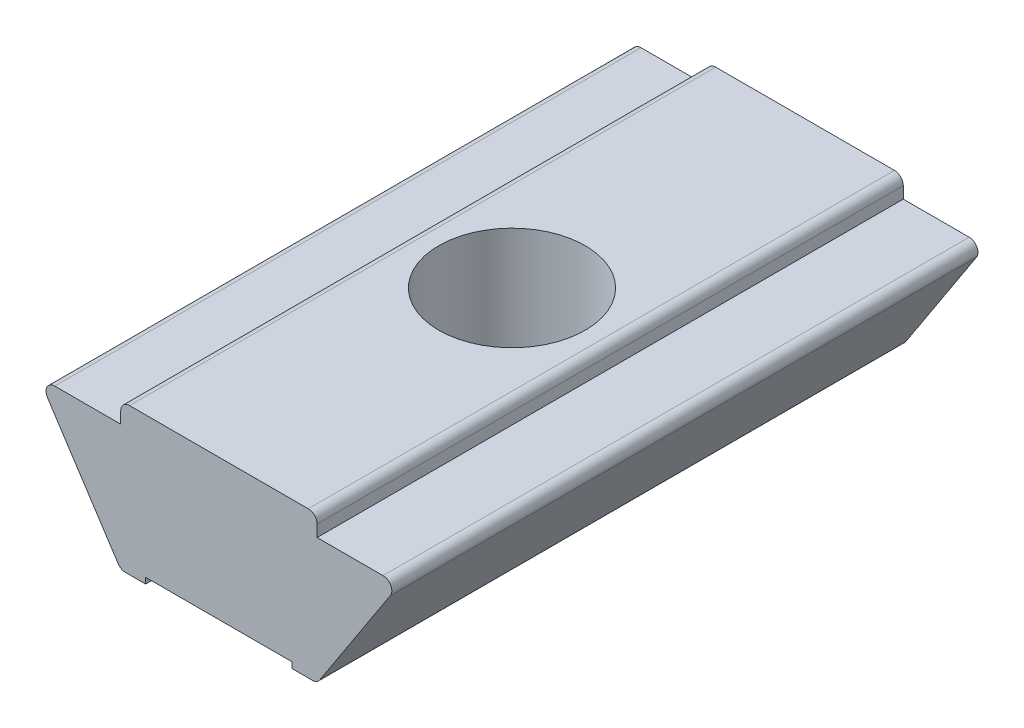
ISO-10303-21;
HEADER;
FILE_DESCRIPTION(('STEP AP214'),'2;1');
FILE_NAME('part.step','',(''),(''),'','','');
FILE_SCHEMA(('AUTOMOTIVE_DESIGN { 1 0 10303 214 1 1 1 1 }'));
ENDSEC;
DATA;
#1=APPLICATION_CONTEXT('core data for automotive mechanical design processes');
#2=APPLICATION_PROTOCOL_DEFINITION('international standard','automotive_design',2000,#1);
#3=PRODUCT_CONTEXT('',#1,'mechanical');
#4=PRODUCT('Part','Part','',(#3));
#5=PRODUCT_RELATED_PRODUCT_CATEGORY('part','',(#4));
#6=PRODUCT_DEFINITION_FORMATION('','',#4);
#7=PRODUCT_DEFINITION_CONTEXT('part definition',#1,'design');
#8=PRODUCT_DEFINITION('design','',#6,#7);
#9=PRODUCT_DEFINITION_SHAPE('','',#8);
#10=(LENGTH_UNIT() NAMED_UNIT(*) SI_UNIT(.MILLI.,.METRE.));
#11=(NAMED_UNIT(*) PLANE_ANGLE_UNIT() SI_UNIT($,.RADIAN.));
#12=(NAMED_UNIT(*) SI_UNIT($,.STERADIAN.) SOLID_ANGLE_UNIT());
#13=UNCERTAINTY_MEASURE_WITH_UNIT(LENGTH_MEASURE(1.E-05),#10,'distance_accuracy_value','');
#14=(GEOMETRIC_REPRESENTATION_CONTEXT(3) GLOBAL_UNCERTAINTY_ASSIGNED_CONTEXT((#13)) GLOBAL_UNIT_ASSIGNED_CONTEXT((#10,
#11,#12)) REPRESENTATION_CONTEXT('',''));
#15=CARTESIAN_POINT('',(0.,0.,0.));
#16=DIRECTION('',(0.,0.,1.));
#17=DIRECTION('',(1.,0.,0.));
#18=AXIS2_PLACEMENT_3D('',#15,#16,#17);
#19=CARTESIAN_POINT('',(0.687460104318916,0.199999999999977,0.));
#20=DIRECTION('',(0.,1.,0.));
#21=DIRECTION('',(-1.,0.,0.));
#22=AXIS2_PLACEMENT_3D('',#19,#20,#21);
#23=PLANE('',#22);
#24=DIRECTION('',(1.,0.,2.52850277105468E-12));
#25=VECTOR('',#24,1.);
#26=CARTESIAN_POINT('',(0.687460104311939,0.199999999999977,2.75940576108429));
#27=LINE('',#26,#25);
#28=CARTESIAN_POINT('',(0.687460104318916,0.199999999999977,2.75940576108429));
#29=VERTEX_POINT('',#28);
#30=CARTESIAN_POINT('',(5.68746010431892,0.199999999999977,2.75940576109693));
#31=VERTEX_POINT('',#30);
#32=EDGE_CURVE('E255',#29,#31,#27,.T.);
#33=ORIENTED_EDGE('',*,*,#32,.F.);
#34=DIRECTION('',(0.,0.,1.));
#35=VECTOR('',#34,1.);
#36=CARTESIAN_POINT('',(0.687460104318916,0.199999999999977,0.));
#37=LINE('',#36,#35);
#38=CARTESIAN_POINT('',(0.687460104318916,0.199999999999977,0.));
#39=VERTEX_POINT('',#38);
#40=EDGE_CURVE('E274',#39,#29,#37,.T.);
#41=ORIENTED_EDGE('',*,*,#40,.F.);
#42=CARTESIAN_POINT('',(3.18746010431892,0.199999999999977,0.));
#43=DIRECTION('',(0.,1.,0.));
#44=DIRECTION('',(-1.,0.,0.));
#45=AXIS2_PLACEMENT_3D('',#42,#43,#44);
#46=CIRCLE('',#45,2.49999999999999);
#47=CARTESIAN_POINT('',(5.68746010431891,0.199999999999978,0.));
#48=VERTEX_POINT('',#47);
#49=EDGE_CURVE('E399',#48,#39,#46,.F.);
#50=ORIENTED_EDGE('',*,*,#49,.F.);
#51=DIRECTION('',(0.,0.,1.));
#52=VECTOR('',#51,1.);
#53=CARTESIAN_POINT('',(5.68746010431892,0.199999999999978,0.));
#54=LINE('',#53,#52);
#55=EDGE_CURVE('E279',#48,#31,#54,.T.);
#56=ORIENTED_EDGE('',*,*,#55,.T.);
#57=EDGE_LOOP('',(#33,#41,#50,#56));
#58=FACE_BOUND('',#57,.T.);
#59=ADVANCED_FACE('F37',(#58),#23,.F.);
#60=DIRECTION('',(1.,-1.13732807893703E-12,0.));
#61=VECTOR('',#60,1.);
#62=CARTESIAN_POINT('',(0.687460104313889,0.199999999999977,3.0031589604741));
#63=LINE('',#62,#61);
#64=CARTESIAN_POINT('',(0.687460104318916,0.199999999999977,3.0031589604741));
#65=VERTEX_POINT('',#64);
#66=CARTESIAN_POINT('',(5.68746010431389,0.19999999999429,3.0031589604741));
#67=VERTEX_POINT('',#66);
#68=EDGE_CURVE('E249',#65,#67,#63,.T.);
#69=ORIENTED_EDGE('',*,*,#68,.T.);
#70=CARTESIAN_POINT('',(5.68746010431892,0.199999999999978,10.));
#71=VERTEX_POINT('',#70);
#72=EDGE_CURVE('E282',#67,#71,#54,.T.);
#73=ORIENTED_EDGE('',*,*,#72,.T.);
#74=DIRECTION('',(-1.,0.,0.));
#75=VECTOR('',#74,1.);
#76=CARTESIAN_POINT('',(0.687460104318916,0.199999999999977,10.));
#77=LINE('',#76,#75);
#78=CARTESIAN_POINT('',(0.687460104318916,0.199999999999977,10.));
#79=VERTEX_POINT('',#78);
#80=EDGE_CURVE('E263',#71,#79,#77,.T.);
#81=ORIENTED_EDGE('',*,*,#80,.T.);
#82=EDGE_CURVE('E278',#65,#79,#37,.T.);
#83=ORIENTED_EDGE('',*,*,#82,.F.);
#84=EDGE_LOOP('',(#69,#73,#81,#83));
#85=FACE_BOUND('',#84,.T.);
#86=ADVANCED_FACE('F503',(#85),#23,.F.);
#87=CARTESIAN_POINT('',(0.687460104318917,0.,0.));
#88=DIRECTION('',(-1.,0.,0.));
#89=DIRECTION('',(0.,-1.,0.));
#90=AXIS2_PLACEMENT_3D('',#87,#88,#89);
#91=PLANE('',#90);
#92=DIRECTION('',(-4.66580283281373E-13,-0.410251025423788,-0.911972640016536));
#93=VECTOR('',#92,1.);
#94=CARTESIAN_POINT('',(0.687460104314014,0.309652412377378,3.0031589604741));
#95=LINE('',#94,#93);
#96=CARTESIAN_POINT('',(0.687460104318917,0.,2.31481326356428));
#97=VERTEX_POINT('',#96);
#98=EDGE_CURVE('E245',#29,#97,#95,.T.);
#99=ORIENTED_EDGE('',*,*,#98,.T.);
#100=DIRECTION('',(0.,0.,1.));
#101=VECTOR('',#100,1.);
#102=CARTESIAN_POINT('',(0.687460104318917,0.,0.));
#103=LINE('',#102,#101);
#104=CARTESIAN_POINT('',(0.687460104318917,0.,0.));
#105=VERTEX_POINT('',#104);
#106=EDGE_CURVE('E288',#105,#97,#103,.T.);
#107=ORIENTED_EDGE('',*,*,#106,.F.);
#108=DIRECTION('',(0.,-1.,0.));
#109=VECTOR('',#108,1.);
#110=CARTESIAN_POINT('',(0.687460104318917,0.,0.));
#111=LINE('',#110,#109);
#112=EDGE_CURVE('E259',#39,#105,#111,.T.);
#113=ORIENTED_EDGE('',*,*,#112,.F.);
#114=ORIENTED_EDGE('',*,*,#40,.T.);
#115=EDGE_LOOP('',(#99,#107,#113,#114));
#116=FACE_BOUND('',#115,.T.);
#117=ADVANCED_FACE('F522',(#116),#91,.F.);
#118=DIRECTION('',(4.66606484518041E-13,0.410251025423788,0.911972640016536));
#119=VECTOR('',#118,1.);
#120=CARTESIAN_POINT('',(0.687460104313889,0.199999999999977,3.0031589604741));
#121=LINE('',#120,#119);
#122=CARTESIAN_POINT('',(0.687460104318917,0.,2.55856646295409));
#123=VERTEX_POINT('',#122);
#124=EDGE_CURVE('E60',#123,#65,#121,.T.);
#125=ORIENTED_EDGE('',*,*,#124,.T.);
#126=ORIENTED_EDGE('',*,*,#82,.T.);
#127=DIRECTION('',(0.,-1.,0.));
#128=VECTOR('',#127,1.);
#129=CARTESIAN_POINT('',(0.687460104318917,0.,10.));
#130=LINE('',#129,#128);
#131=CARTESIAN_POINT('',(0.687460104318917,0.,10.));
#132=VERTEX_POINT('',#131);
#133=EDGE_CURVE('E258',#79,#132,#130,.T.);
#134=ORIENTED_EDGE('',*,*,#133,.T.);
#135=EDGE_CURVE('E266',#123,#132,#103,.T.);
#136=ORIENTED_EDGE('',*,*,#135,.F.);
#137=EDGE_LOOP('',(#125,#126,#134,#136));
#138=FACE_BOUND('',#137,.T.);
#139=ADVANCED_FACE('F500',(#138),#91,.F.);
#140=CARTESIAN_POINT('',(5.68746010431892,0.,0.));
#141=DIRECTION('',(1.,0.,0.));
#142=DIRECTION('',(0.,1.,0.));
#143=AXIS2_PLACEMENT_3D('',#140,#141,#142);
#144=PLANE('',#143);
#145=DIRECTION('',(0.,-0.410251025423788,-0.911972640016536));
#146=VECTOR('',#145,1.);
#147=CARTESIAN_POINT('',(5.68746010431892,-0.866058935191074,0.389596738596369));
#148=LINE('',#147,#146);
#149=CARTESIAN_POINT('',(5.68746010431892,0.,2.31481326357692));
#150=VERTEX_POINT('',#149);
#151=EDGE_CURVE('E45',#31,#150,#148,.T.);
#152=ORIENTED_EDGE('',*,*,#151,.F.);
#153=ORIENTED_EDGE('',*,*,#55,.F.);
#154=DIRECTION('',(0.,1.,0.));
#155=VECTOR('',#154,1.);
#156=CARTESIAN_POINT('',(5.68746010431892,0.,0.));
#157=LINE('',#156,#155);
#158=CARTESIAN_POINT('',(5.68746010431892,0.,0.));
#159=VERTEX_POINT('',#158);
#160=EDGE_CURVE('E262',#159,#48,#157,.T.);
#161=ORIENTED_EDGE('',*,*,#160,.F.);
#162=DIRECTION('',(0.,0.,1.));
#163=VECTOR('',#162,1.);
#164=CARTESIAN_POINT('',(5.68746010431892,0.,0.));
#165=LINE('',#164,#163);
#166=EDGE_CURVE('E283',#159,#150,#165,.T.);
#167=ORIENTED_EDGE('',*,*,#166,.T.);
#168=EDGE_LOOP('',(#152,#153,#161,#167));
#169=FACE_BOUND('',#168,.T.);
#170=ADVANCED_FACE('F410',(#169),#144,.F.);
#171=DIRECTION('',(0.,0.410251025423788,0.911972640016536));
#172=VECTOR('',#171,1.);
#173=CARTESIAN_POINT('',(5.68746010431892,-0.957256199192727,0.430621841138747));
#174=LINE('',#173,#172);
#175=CARTESIAN_POINT('',(5.68746010431892,0.,2.55856646296673));
#176=VERTEX_POINT('',#175);
#177=EDGE_CURVE('E402',#176,#67,#174,.T.);
#178=ORIENTED_EDGE('',*,*,#177,.F.);
#179=CARTESIAN_POINT('',(5.68746010431892,0.,10.));
#180=VERTEX_POINT('',#179);
#181=EDGE_CURVE('E287',#176,#180,#165,.T.);
#182=ORIENTED_EDGE('',*,*,#181,.T.);
#183=DIRECTION('',(0.,1.,0.));
#184=VECTOR('',#183,1.);
#185=CARTESIAN_POINT('',(5.68746010431892,0.,10.));
#186=LINE('',#185,#184);
#187=EDGE_CURVE('E269',#180,#71,#186,.T.);
#188=ORIENTED_EDGE('',*,*,#187,.T.);
#189=ORIENTED_EDGE('',*,*,#72,.F.);
#190=EDGE_LOOP('',(#178,#182,#188,#189));
#191=FACE_BOUND('',#190,.T.);
#192=ADVANCED_FACE('F428',(#191),#144,.F.);
#193=CARTESIAN_POINT('',(0.137460104318961,4.70000000000005,10.));
#194=DIRECTION('',(0.,0.,-1.));
#195=DIRECTION('',(-1.,0.,0.));
#196=AXIS2_PLACEMENT_3D('',#193,#194,#195);
#197=CYLINDRICAL_SURFACE('',#196,0.299999999999955);
#198=CARTESIAN_POINT('',(0.137460104318961,4.70000000000005,-10.));
#199=DIRECTION('',(0.,0.,1.));
#200=DIRECTION('',(1.,0.,0.));
#201=AXIS2_PLACEMENT_3D('',#198,#199,#200);
#202=CIRCLE('',#201,0.299999999999955);
#203=CARTESIAN_POINT('',(0.137460104318961,5.,-10.));
#204=VERTEX_POINT('',#203);
#205=CARTESIAN_POINT('',(-0.162539895680993,4.70000000000016,-10.));
#206=VERTEX_POINT('',#205);
#207=EDGE_CURVE('E297',#204,#206,#202,.T.);
#208=ORIENTED_EDGE('',*,*,#207,.T.);
#209=DIRECTION('',(0.,0.,-1.));
#210=VECTOR('',#209,1.);
#211=CARTESIAN_POINT('',(-0.162539895680993,4.70000000000016,10.));
#212=LINE('',#211,#210);
#213=CARTESIAN_POINT('',(-0.162539895680993,4.70000000000016,10.));
#214=VERTEX_POINT('',#213);
#215=EDGE_CURVE('E396',#214,#206,#212,.T.);
#216=ORIENTED_EDGE('',*,*,#215,.F.);
#217=CARTESIAN_POINT('',(0.137460104318961,4.70000000000005,10.));
#218=DIRECTION('',(0.,0.,1.));
#219=DIRECTION('',(1.,0.,0.));
#220=AXIS2_PLACEMENT_3D('',#217,#218,#219);
#221=CIRCLE('',#220,0.299999999999955);
#222=CARTESIAN_POINT('',(0.137460104318961,5.,10.));
#223=VERTEX_POINT('',#222);
#224=EDGE_CURVE('E298',#223,#214,#221,.T.);
#225=ORIENTED_EDGE('',*,*,#224,.F.);
#226=DIRECTION('',(0.,0.,-1.));
#227=VECTOR('',#226,1.);
#228=CARTESIAN_POINT('',(0.137460104318961,5.,10.));
#229=LINE('',#228,#227);
#230=EDGE_CURVE('E330',#223,#204,#229,.T.);
#231=ORIENTED_EDGE('',*,*,#230,.T.);
#232=EDGE_LOOP('',(#208,#216,#225,#231));
#233=FACE_BOUND('',#232,.T.);
#234=ADVANCED_FACE('F39',(#233),#197,.T.);
#235=CARTESIAN_POINT('',(-0.162539895680993,4.70000000000016,10.));
#236=DIRECTION('',(1.,-1.13732807893703E-12,0.));
#237=DIRECTION('',(1.13732807893703E-12,1.,0.));
#238=AXIS2_PLACEMENT_3D('',#235,#236,#237);
#239=PLANE('',#238);
#240=DIRECTION('',(-1.13732807893703E-12,-1.,0.));
#241=VECTOR('',#240,1.);
#242=CARTESIAN_POINT('',(-0.162539895680993,4.70000000000016,-10.));
#243=LINE('',#242,#241);
#244=CARTESIAN_POINT('',(-0.162539895681448,4.30000000000007,-10.));
#245=VERTEX_POINT('',#244);
#246=EDGE_CURVE('E333',#206,#245,#243,.T.);
#247=ORIENTED_EDGE('',*,*,#246,.T.);
#248=DIRECTION('',(0.,0.,-1.));
#249=VECTOR('',#248,1.);
#250=CARTESIAN_POINT('',(-0.162539895681448,4.30000000000007,10.));
#251=LINE('',#250,#249);
#252=CARTESIAN_POINT('',(-0.162539895681448,4.30000000000007,10.));
#253=VERTEX_POINT('',#252);
#254=EDGE_CURVE('E393',#253,#245,#251,.T.);
#255=ORIENTED_EDGE('',*,*,#254,.F.);
#256=DIRECTION('',(-1.13732807893703E-12,-1.,0.));
#257=VECTOR('',#256,1.);
#258=CARTESIAN_POINT('',(-0.162539895680993,4.70000000000016,10.));
#259=LINE('',#258,#257);
#260=EDGE_CURVE('E301',#214,#253,#259,.T.);
#261=ORIENTED_EDGE('',*,*,#260,.F.);
#262=ORIENTED_EDGE('',*,*,#215,.T.);
#263=EDGE_LOOP('',(#247,#255,#261,#262));
#264=FACE_BOUND('',#263,.T.);
#265=ADVANCED_FACE('F476',(#264),#239,.F.);
#266=CARTESIAN_POINT('',(-2.41253989568122,4.29999999999995,10.));
#267=DIRECTION('',(0.,-1.,0.));
#268=DIRECTION('',(1.,0.,0.));
#269=AXIS2_PLACEMENT_3D('',#266,#267,#268);
#270=PLANE('',#269);
#271=DIRECTION('',(-1.,0.,0.));
#272=VECTOR('',#271,1.);
#273=CARTESIAN_POINT('',(-2.41253989568122,4.29999999999995,-10.));
#274=LINE('',#273,#272);
#275=CARTESIAN_POINT('',(-2.41253989568122,4.29999999999995,-10.));
#276=VERTEX_POINT('',#275);
#277=EDGE_CURVE('E335',#245,#276,#274,.T.);
#278=ORIENTED_EDGE('',*,*,#277,.T.);
#279=DIRECTION('',(0.,0.,-1.));
#280=VECTOR('',#279,1.);
#281=CARTESIAN_POINT('',(-2.41253989568122,4.29999999999995,10.));
#282=LINE('',#281,#280);
#283=CARTESIAN_POINT('',(-2.41253989568122,4.29999999999995,10.));
#284=VERTEX_POINT('',#283);
#285=EDGE_CURVE('E390',#284,#276,#282,.T.);
#286=ORIENTED_EDGE('',*,*,#285,.F.);
#287=DIRECTION('',(-1.,0.,0.));
#288=VECTOR('',#287,1.);
#289=CARTESIAN_POINT('',(-2.41253989568122,4.29999999999995,10.));
#290=LINE('',#289,#288);
#291=EDGE_CURVE('E304',#253,#284,#290,.T.);
#292=ORIENTED_EDGE('',*,*,#291,.F.);
#293=ORIENTED_EDGE('',*,*,#254,.T.);
#294=EDGE_LOOP('',(#278,#286,#292,#293));
#295=FACE_BOUND('',#294,.T.);
#296=ADVANCED_FACE('F481',(#295),#270,.F.);
#297=CARTESIAN_POINT('',(-2.41253989568122,4.,10.));
#298=DIRECTION('',(0.,0.,-1.));
#299=DIRECTION('',(-1.,0.,0.));
#300=AXIS2_PLACEMENT_3D('',#297,#298,#299);
#301=CYLINDRICAL_SURFACE('',#300,0.299999999999944);
#302=CARTESIAN_POINT('',(-2.41253989568122,4.,-10.));
#303=DIRECTION('',(0.,0.,1.));
#304=DIRECTION('',(1.,0.,0.));
#305=AXIS2_PLACEMENT_3D('',#302,#303,#304);
#306=CIRCLE('',#305,0.299999999999944);
#307=CARTESIAN_POINT('',(-2.67057860439082,3.84697704483494,-10.));
#308=VERTEX_POINT('',#307);
#309=EDGE_CURVE('E337',#276,#308,#306,.T.);
#310=ORIENTED_EDGE('',*,*,#309,.T.);
#311=DIRECTION('',(0.,0.,-1.));
#312=VECTOR('',#311,1.);
#313=CARTESIAN_POINT('',(-2.67057860439082,3.84697704483494,10.));
#314=LINE('',#313,#312);
#315=CARTESIAN_POINT('',(-2.67057860439082,3.84697704483494,10.));
#316=VERTEX_POINT('',#315);
#317=EDGE_CURVE('E387',#316,#308,#314,.T.);
#318=ORIENTED_EDGE('',*,*,#317,.F.);
#319=CARTESIAN_POINT('',(-2.41253989568122,4.,10.));
#320=DIRECTION('',(0.,0.,1.));
#321=DIRECTION('',(1.,0.,0.));
#322=AXIS2_PLACEMENT_3D('',#319,#320,#321);
#323=CIRCLE('',#322,0.299999999999944);
#324=EDGE_CURVE('E306',#284,#316,#323,.T.);
#325=ORIENTED_EDGE('',*,*,#324,.F.);
#326=ORIENTED_EDGE('',*,*,#285,.T.);
#327=EDGE_LOOP('',(#310,#318,#325,#326));
#328=FACE_BOUND('',#327,.T.);
#329=ADVANCED_FACE('F487',(#328),#301,.T.);
#330=CARTESIAN_POINT('',(-0.251308862949119,0.136159054558282,10.));
#331=DIRECTION('',(0.837696209830385,0.546136484805591,0.));
#332=DIRECTION('',(-0.546136484805591,0.837696209830386,0.));
#333=AXIS2_PLACEMENT_3D('',#330,#331,#332);
#334=PLANE('',#333);
#335=DIRECTION('',(0.546136484805591,-0.837696209830385,0.));
#336=VECTOR('',#335,1.);
#337=CARTESIAN_POINT('',(-0.251308862949119,0.136159054558282,-10.));
#338=LINE('',#337,#336);
#339=CARTESIAN_POINT('',(-0.251308862949119,0.136159054558282,-10.));
#340=VERTEX_POINT('',#339);
#341=EDGE_CURVE('E339',#308,#340,#338,.T.);
#342=ORIENTED_EDGE('',*,*,#341,.T.);
#343=DIRECTION('',(0.,0.,-1.));
#344=VECTOR('',#343,1.);
#345=CARTESIAN_POINT('',(-0.251308862949119,0.136159054558282,10.));
#346=LINE('',#345,#344);
#347=CARTESIAN_POINT('',(-0.251308862949119,0.136159054558282,10.));
#348=VERTEX_POINT('',#347);
#349=EDGE_CURVE('E384',#348,#340,#346,.T.);
#350=ORIENTED_EDGE('',*,*,#349,.F.);
#351=DIRECTION('',(0.546136484805591,-0.837696209830385,0.));
#352=VECTOR('',#351,1.);
#353=CARTESIAN_POINT('',(-0.251308862949119,0.136159054558282,10.));
#354=LINE('',#353,#352);
#355=EDGE_CURVE('E308',#316,#348,#354,.T.);
#356=ORIENTED_EDGE('',*,*,#355,.F.);
#357=ORIENTED_EDGE('',*,*,#317,.T.);
#358=EDGE_LOOP('',(#342,#350,#356,#357));
#359=FACE_BOUND('',#358,.T.);
#360=ADVANCED_FACE('F491',(#359),#334,.F.);
#361=CARTESIAN_POINT('',(0.,0.299999999999954,10.));
#362=DIRECTION('',(0.,0.,-1.));
#363=DIRECTION('',(-1.,0.,0.));
#364=AXIS2_PLACEMENT_3D('',#361,#362,#363);
#365=CYLINDRICAL_SURFACE('',#364,0.299999999999977);
#366=CARTESIAN_POINT('',(0.,0.299999999999954,-10.));
#367=DIRECTION('',(0.,0.,1.));
#368=DIRECTION('',(1.,0.,0.));
#369=AXIS2_PLACEMENT_3D('',#366,#367,#368);
#370=CIRCLE('',#369,0.299999999999977);
#371=CARTESIAN_POINT('',(0.,0.,-10.));
#372=VERTEX_POINT('',#371);
#373=EDGE_CURVE('E341',#340,#372,#370,.T.);
#374=ORIENTED_EDGE('',*,*,#373,.T.);
#375=DIRECTION('',(0.,0.,-1.));
#376=VECTOR('',#375,1.);
#377=CARTESIAN_POINT('',(0.,0.,10.));
#378=LINE('',#377,#376);
#379=CARTESIAN_POINT('',(0.,0.,10.));
#380=VERTEX_POINT('',#379);
#381=EDGE_CURVE('E381',#380,#372,#378,.T.);
#382=ORIENTED_EDGE('',*,*,#381,.F.);
#383=CARTESIAN_POINT('',(0.,0.299999999999954,10.));
#384=DIRECTION('',(0.,0.,1.));
#385=DIRECTION('',(1.,0.,0.));
#386=AXIS2_PLACEMENT_3D('',#383,#384,#385);
#387=CIRCLE('',#386,0.299999999999977);
#388=EDGE_CURVE('E310',#348,#380,#387,.T.);
#389=ORIENTED_EDGE('',*,*,#388,.F.);
#390=ORIENTED_EDGE('',*,*,#349,.T.);
#391=EDGE_LOOP('',(#374,#382,#389,#390));
#392=FACE_BOUND('',#391,.T.);
#393=ADVANCED_FACE('F496',(#392),#365,.T.);
#394=CARTESIAN_POINT('',(0.,0.,10.));
#395=DIRECTION('',(0.,1.,0.));
#396=DIRECTION('',(-1.,0.,0.));
#397=AXIS2_PLACEMENT_3D('',#394,#395,#396);
#398=PLANE('',#397);
#399=CARTESIAN_POINT('',(3.18746010431892,0.,0.));
#400=DIRECTION('',(0.,1.,0.));
#401=DIRECTION('',(0.,0.,1.));
#402=AXIS2_PLACEMENT_3D('',#399,#400,#401);
#403=CIRCLE('',#402,2.5);
#404=EDGE_CURVE('E294',#159,#105,#403,.T.);
#405=ORIENTED_EDGE('',*,*,#404,.T.);
#406=ORIENTED_EDGE('',*,*,#106,.T.);
#407=EDGE_CURVE('E291',#97,#123,#103,.T.);
#408=ORIENTED_EDGE('',*,*,#407,.T.);
#409=ORIENTED_EDGE('',*,*,#135,.T.);
#410=DIRECTION('',(1.,0.,0.));
#411=VECTOR('',#410,1.);
#412=CARTESIAN_POINT('',(0.,0.,10.));
#413=LINE('',#412,#411);
#414=EDGE_CURVE('E313',#380,#132,#413,.T.);
#415=ORIENTED_EDGE('',*,*,#414,.F.);
#416=ORIENTED_EDGE('',*,*,#381,.T.);
#417=DIRECTION('',(1.,0.,0.));
#418=VECTOR('',#417,1.);
#419=CARTESIAN_POINT('',(0.,0.,-10.));
#420=LINE('',#419,#418);
#421=CARTESIAN_POINT('',(6.3749202086376,1.13624387676481E-13,-10.));
#422=VERTEX_POINT('',#421);
#423=EDGE_CURVE('E343',#372,#422,#420,.T.);
#424=ORIENTED_EDGE('',*,*,#423,.T.);
#425=DIRECTION('',(0.,0.,-1.));
#426=VECTOR('',#425,1.);
#427=CARTESIAN_POINT('',(6.3749202086376,1.13624387676481E-13,10.));
#428=LINE('',#427,#426);
#429=CARTESIAN_POINT('',(6.3749202086376,1.13624387676481E-13,10.));
#430=VERTEX_POINT('',#429);
#431=EDGE_CURVE('E378',#430,#422,#428,.T.);
#432=ORIENTED_EDGE('',*,*,#431,.F.);
#433=EDGE_CURVE('E312',#180,#430,#413,.T.);
#434=ORIENTED_EDGE('',*,*,#433,.F.);
#435=ORIENTED_EDGE('',*,*,#181,.F.);
#436=EDGE_CURVE('E286',#150,#176,#165,.T.);
#437=ORIENTED_EDGE('',*,*,#436,.F.);
#438=ORIENTED_EDGE('',*,*,#166,.F.);
#439=EDGE_LOOP('',(#405,#406,#408,#409,#415,#416,#424,#432,#434,#435,#437,#438));
#440=FACE_BOUND('',#439,.T.);
#441=ADVANCED_FACE('F420',(#440),#398,.F.);
#442=CARTESIAN_POINT('',(6.3749202086376,0.300000000000068,10.));
#443=DIRECTION('',(0.,0.,-1.));
#444=DIRECTION('',(-1.,0.,0.));
#445=AXIS2_PLACEMENT_3D('',#442,#443,#444);
#446=CYLINDRICAL_SURFACE('',#445,0.300000000000005);
#447=CARTESIAN_POINT('',(6.3749202086376,0.300000000000068,-10.));
#448=DIRECTION('',(0.,0.,1.));
#449=DIRECTION('',(1.,0.,0.));
#450=AXIS2_PLACEMENT_3D('',#447,#448,#449);
#451=CIRCLE('',#450,0.300000000000005);
#452=CARTESIAN_POINT('',(6.62622907158671,0.136159054558361,-10.));
#453=VERTEX_POINT('',#452);
#454=EDGE_CURVE('E345',#422,#453,#451,.T.);
#455=ORIENTED_EDGE('',*,*,#454,.T.);
#456=DIRECTION('',(0.,0.,-1.));
#457=VECTOR('',#456,1.);
#458=CARTESIAN_POINT('',(6.62622907158671,0.136159054558361,10.));
#459=LINE('',#458,#457);
#460=CARTESIAN_POINT('',(6.62622907158671,0.136159054558361,10.));
#461=VERTEX_POINT('',#460);
#462=EDGE_CURVE('E375',#461,#453,#459,.T.);
#463=ORIENTED_EDGE('',*,*,#462,.F.);
#464=CARTESIAN_POINT('',(6.3749202086376,0.300000000000068,10.));
#465=DIRECTION('',(0.,0.,1.));
#466=DIRECTION('',(1.,0.,0.));
#467=AXIS2_PLACEMENT_3D('',#464,#465,#466);
#468=CIRCLE('',#467,0.300000000000005);
#469=EDGE_CURVE('E316',#430,#461,#468,.T.);
#470=ORIENTED_EDGE('',*,*,#469,.F.);
#471=ORIENTED_EDGE('',*,*,#431,.T.);
#472=EDGE_LOOP('',(#455,#463,#470,#471));
#473=FACE_BOUND('',#472,.T.);
#474=ADVANCED_FACE('F439',(#473),#446,.T.);
#475=CARTESIAN_POINT('',(6.62622907158675,0.136159054558334,10.));
#476=DIRECTION('',(-0.837696209830361,0.546136484805628,0.));
#477=DIRECTION('',(-0.546136484805628,-0.837696209830361,0.));
#478=AXIS2_PLACEMENT_3D('',#475,#476,#477);
#479=PLANE('',#478);
#480=DIRECTION('',(0.546136484805628,0.837696209830361,0.));
#481=VECTOR('',#480,1.);
#482=CARTESIAN_POINT('',(6.62622907158675,0.136159054558334,-10.));
#483=LINE('',#482,#481);
#484=CARTESIAN_POINT('',(9.04549881302865,3.84697704483494,-10.));
#485=VERTEX_POINT('',#484);
#486=EDGE_CURVE('E347',#453,#485,#483,.T.);
#487=ORIENTED_EDGE('',*,*,#486,.T.);
#488=DIRECTION('',(0.,0.,-1.));
#489=VECTOR('',#488,1.);
#490=CARTESIAN_POINT('',(9.04549881302865,3.84697704483494,10.));
#491=LINE('',#490,#489);
#492=CARTESIAN_POINT('',(9.04549881302865,3.84697704483494,10.));
#493=VERTEX_POINT('',#492);
#494=EDGE_CURVE('E372',#493,#485,#491,.T.);
#495=ORIENTED_EDGE('',*,*,#494,.F.);
#496=DIRECTION('',(0.546136484805628,0.837696209830361,0.));
#497=VECTOR('',#496,1.);
#498=CARTESIAN_POINT('',(6.62622907158675,0.136159054558334,10.));
#499=LINE('',#498,#497);
#500=EDGE_CURVE('E318',#461,#493,#499,.T.);
#501=ORIENTED_EDGE('',*,*,#500,.F.);
#502=ORIENTED_EDGE('',*,*,#462,.T.);
#503=EDGE_LOOP('',(#487,#495,#501,#502));
#504=FACE_BOUND('',#503,.T.);
#505=ADVANCED_FACE('F445',(#504),#479,.F.);
#506=CARTESIAN_POINT('',(8.78746010431905,4.,10.));
#507=DIRECTION('',(0.,0.,-1.));
#508=DIRECTION('',(-1.,0.,0.));
#509=AXIS2_PLACEMENT_3D('',#506,#507,#508);
#510=CYLINDRICAL_SURFACE('',#509,0.299999999999945);
#511=CARTESIAN_POINT('',(8.78746010431905,4.,-10.));
#512=DIRECTION('',(0.,0.,1.));
#513=DIRECTION('',(1.,0.,0.));
#514=AXIS2_PLACEMENT_3D('',#511,#512,#513);
#515=CIRCLE('',#514,0.299999999999945);
#516=CARTESIAN_POINT('',(8.78746010431905,4.29999999999994,-10.));
#517=VERTEX_POINT('',#516);
#518=EDGE_CURVE('E349',#485,#517,#515,.T.);
#519=ORIENTED_EDGE('',*,*,#518,.T.);
#520=DIRECTION('',(0.,0.,-1.));
#521=VECTOR('',#520,1.);
#522=CARTESIAN_POINT('',(8.78746010431905,4.29999999999994,10.));
#523=LINE('',#522,#521);
#524=CARTESIAN_POINT('',(8.78746010431905,4.29999999999994,10.));
#525=VERTEX_POINT('',#524);
#526=EDGE_CURVE('E369',#525,#517,#523,.T.);
#527=ORIENTED_EDGE('',*,*,#526,.F.);
#528=CARTESIAN_POINT('',(8.78746010431905,4.,10.));
#529=DIRECTION('',(0.,0.,1.));
#530=DIRECTION('',(1.,0.,0.));
#531=AXIS2_PLACEMENT_3D('',#528,#529,#530);
#532=CIRCLE('',#531,0.299999999999945);
#533=EDGE_CURVE('E320',#493,#525,#532,.T.);
#534=ORIENTED_EDGE('',*,*,#533,.F.);
#535=ORIENTED_EDGE('',*,*,#494,.T.);
#536=EDGE_LOOP('',(#519,#527,#534,#535));
#537=FACE_BOUND('',#536,.T.);
#538=ADVANCED_FACE('F449',(#537),#510,.T.);
#539=CARTESIAN_POINT('',(6.53746010431883,4.30000000000007,10.));
#540=DIRECTION('',(0.,-1.,0.));
#541=DIRECTION('',(1.,0.,0.));
#542=AXIS2_PLACEMENT_3D('',#539,#540,#541);
#543=PLANE('',#542);
#544=DIRECTION('',(-1.,0.,0.));
#545=VECTOR('',#544,1.);
#546=CARTESIAN_POINT('',(6.53746010431883,4.30000000000007,-10.));
#547=LINE('',#546,#545);
#548=CARTESIAN_POINT('',(6.53746010431883,4.30000000000007,-10.));
#549=VERTEX_POINT('',#548);
#550=EDGE_CURVE('E351',#517,#549,#547,.T.);
#551=ORIENTED_EDGE('',*,*,#550,.T.);
#552=DIRECTION('',(0.,0.,-1.));
#553=VECTOR('',#552,1.);
#554=CARTESIAN_POINT('',(6.53746010431883,4.30000000000007,10.));
#555=LINE('',#554,#553);
#556=CARTESIAN_POINT('',(6.53746010431883,4.30000000000007,10.));
#557=VERTEX_POINT('',#556);
#558=EDGE_CURVE('E366',#557,#549,#555,.T.);
#559=ORIENTED_EDGE('',*,*,#558,.F.);
#560=DIRECTION('',(-1.,0.,0.));
#561=VECTOR('',#560,1.);
#562=CARTESIAN_POINT('',(6.53746010431883,4.30000000000007,10.));
#563=LINE('',#562,#561);
#564=EDGE_CURVE('E322',#525,#557,#563,.T.);
#565=ORIENTED_EDGE('',*,*,#564,.F.);
#566=ORIENTED_EDGE('',*,*,#526,.T.);
#567=EDGE_LOOP('',(#551,#559,#565,#566));
#568=FACE_BOUND('',#567,.T.);
#569=ADVANCED_FACE('F454',(#568),#543,.F.);
#570=CARTESIAN_POINT('',(6.53746010431883,4.70000000000016,10.));
#571=DIRECTION('',(-1.,0.,0.));
#572=DIRECTION('',(0.,0.,1.));
#573=AXIS2_PLACEMENT_3D('',#570,#571,#572);
#574=PLANE('',#573);
#575=DIRECTION('',(0.,1.,0.));
#576=VECTOR('',#575,1.);
#577=CARTESIAN_POINT('',(6.53746010431883,4.70000000000016,-10.));
#578=LINE('',#577,#576);
#579=CARTESIAN_POINT('',(6.53746010431883,4.70000000000016,-10.));
#580=VERTEX_POINT('',#579);
#581=EDGE_CURVE('E353',#549,#580,#578,.T.);
#582=ORIENTED_EDGE('',*,*,#581,.T.);
#583=DIRECTION('',(0.,0.,-1.));
#584=VECTOR('',#583,1.);
#585=CARTESIAN_POINT('',(6.53746010431883,4.70000000000016,10.));
#586=LINE('',#585,#584);
#587=CARTESIAN_POINT('',(6.53746010431883,4.70000000000016,10.));
#588=VERTEX_POINT('',#587);
#589=EDGE_CURVE('E363',#588,#580,#586,.T.);
#590=ORIENTED_EDGE('',*,*,#589,.F.);
#591=DIRECTION('',(0.,1.,0.));
#592=VECTOR('',#591,1.);
#593=CARTESIAN_POINT('',(6.53746010431883,4.70000000000016,10.));
#594=LINE('',#593,#592);
#595=EDGE_CURVE('E324',#557,#588,#594,.T.);
#596=ORIENTED_EDGE('',*,*,#595,.F.);
#597=ORIENTED_EDGE('',*,*,#558,.T.);
#598=EDGE_LOOP('',(#582,#590,#596,#597));
#599=FACE_BOUND('',#598,.T.);
#600=ADVANCED_FACE('F460',(#599),#574,.F.);
#601=CARTESIAN_POINT('',(6.23746010431887,4.70000000000005,10.));
#602=DIRECTION('',(0.,0.,-1.));
#603=DIRECTION('',(-1.,0.,0.));
#604=AXIS2_PLACEMENT_3D('',#601,#602,#603);
#605=CYLINDRICAL_SURFACE('',#604,0.299999999999977);
#606=CARTESIAN_POINT('',(6.23746010431887,4.70000000000005,-10.));
#607=DIRECTION('',(0.,0.,1.));
#608=DIRECTION('',(1.,0.,0.));
#609=AXIS2_PLACEMENT_3D('',#606,#607,#608);
#610=CIRCLE('',#609,0.299999999999977);
#611=CARTESIAN_POINT('',(6.23746010431887,5.00000000000002,-10.));
#612=VERTEX_POINT('',#611);
#613=EDGE_CURVE('E355',#580,#612,#610,.T.);
#614=ORIENTED_EDGE('',*,*,#613,.T.);
#615=DIRECTION('',(0.,0.,-1.));
#616=VECTOR('',#615,1.);
#617=CARTESIAN_POINT('',(6.23746010431887,5.00000000000002,10.));
#618=LINE('',#617,#616);
#619=CARTESIAN_POINT('',(6.23746010431887,5.00000000000002,10.));
#620=VERTEX_POINT('',#619);
#621=EDGE_CURVE('E360',#620,#612,#618,.T.);
#622=ORIENTED_EDGE('',*,*,#621,.F.);
#623=CARTESIAN_POINT('',(6.23746010431887,4.70000000000005,10.));
#624=DIRECTION('',(0.,0.,1.));
#625=DIRECTION('',(1.,0.,0.));
#626=AXIS2_PLACEMENT_3D('',#623,#624,#625);
#627=CIRCLE('',#626,0.299999999999977);
#628=EDGE_CURVE('E326',#588,#620,#627,.T.);
#629=ORIENTED_EDGE('',*,*,#628,.F.);
#630=ORIENTED_EDGE('',*,*,#589,.T.);
#631=EDGE_LOOP('',(#614,#622,#629,#630));
#632=FACE_BOUND('',#631,.T.);
#633=ADVANCED_FACE('F464',(#632),#605,.T.);
#634=CARTESIAN_POINT('',(6.23746010431887,5.00000000000005,10.));
#635=DIRECTION('',(0.,-1.,0.));
#636=DIRECTION('',(1.,0.,0.));
#637=AXIS2_PLACEMENT_3D('',#634,#635,#636);
#638=PLANE('',#637);
#639=CARTESIAN_POINT('',(3.18746010431892,5.00000000000002,0.));
#640=DIRECTION('',(0.,1.,0.));
#641=DIRECTION('',(0.,0.,1.));
#642=AXIS2_PLACEMENT_3D('',#639,#640,#641);
#643=CIRCLE('',#642,2.49999999999999);
#644=CARTESIAN_POINT('',(3.18746010431892,5.00000000000002,2.49999999999999));
#645=VERTEX_POINT('',#644);
#646=EDGE_CURVE('E277',#645,#645,#643,.T.);
#647=ORIENTED_EDGE('',*,*,#646,.F.);
#648=EDGE_LOOP('',(#647));
#649=FACE_BOUND('',#648,.T.);
#650=DIRECTION('',(-1.,0.,0.));
#651=VECTOR('',#650,1.);
#652=CARTESIAN_POINT('',(6.23746010431887,5.00000000000005,-10.));
#653=LINE('',#652,#651);
#654=EDGE_CURVE('E302',#612,#204,#653,.T.);
#655=ORIENTED_EDGE('',*,*,#654,.T.);
#656=ORIENTED_EDGE('',*,*,#230,.F.);
#657=DIRECTION('',(-1.,0.,0.));
#658=VECTOR('',#657,1.);
#659=CARTESIAN_POINT('',(6.23746010431887,5.00000000000005,10.));
#660=LINE('',#659,#658);
#661=EDGE_CURVE('E328',#620,#223,#660,.T.);
#662=ORIENTED_EDGE('',*,*,#661,.F.);
#663=ORIENTED_EDGE('',*,*,#621,.T.);
#664=EDGE_LOOP('',(#655,#656,#662,#663));
#665=FACE_BOUND('',#664,.T.);
#666=ADVANCED_FACE('F469',(#649,#665),#638,.F.);
#667=CARTESIAN_POINT('',(0.137460104318961,4.70000000000005,10.));
#668=DIRECTION('',(0.,0.,1.));
#669=DIRECTION('',(1.,0.,0.));
#670=AXIS2_PLACEMENT_3D('',#667,#668,#669);
#671=PLANE('',#670);
#672=ORIENTED_EDGE('',*,*,#133,.F.);
#673=ORIENTED_EDGE('',*,*,#80,.F.);
#674=ORIENTED_EDGE('',*,*,#187,.F.);
#675=ORIENTED_EDGE('',*,*,#433,.T.);
#676=ORIENTED_EDGE('',*,*,#469,.T.);
#677=ORIENTED_EDGE('',*,*,#500,.T.);
#678=ORIENTED_EDGE('',*,*,#533,.T.);
#679=ORIENTED_EDGE('',*,*,#564,.T.);
#680=ORIENTED_EDGE('',*,*,#595,.T.);
#681=ORIENTED_EDGE('',*,*,#628,.T.);
#682=ORIENTED_EDGE('',*,*,#661,.T.);
#683=ORIENTED_EDGE('',*,*,#224,.T.);
#684=ORIENTED_EDGE('',*,*,#260,.T.);
#685=ORIENTED_EDGE('',*,*,#291,.T.);
#686=ORIENTED_EDGE('',*,*,#324,.T.);
#687=ORIENTED_EDGE('',*,*,#355,.T.);
#688=ORIENTED_EDGE('',*,*,#388,.T.);
#689=ORIENTED_EDGE('',*,*,#414,.T.);
#690=EDGE_LOOP('',(#672,#673,#674,#675,#676,#677,#678,#679,#680,#681,#682,#683,#684,#685,#686,
#687,#688,#689));
#691=FACE_BOUND('',#690,.T.);
#692=ADVANCED_FACE('F432',(#691),#671,.T.);
#693=CARTESIAN_POINT('',(0.137460104318961,4.70000000000005,-10.));
#694=DIRECTION('',(0.,0.,1.));
#695=DIRECTION('',(1.,0.,0.));
#696=AXIS2_PLACEMENT_3D('',#693,#694,#695);
#697=PLANE('',#696);
#698=ORIENTED_EDGE('',*,*,#207,.F.);
#699=ORIENTED_EDGE('',*,*,#654,.F.);
#700=ORIENTED_EDGE('',*,*,#613,.F.);
#701=ORIENTED_EDGE('',*,*,#581,.F.);
#702=ORIENTED_EDGE('',*,*,#550,.F.);
#703=ORIENTED_EDGE('',*,*,#518,.F.);
#704=ORIENTED_EDGE('',*,*,#486,.F.);
#705=ORIENTED_EDGE('',*,*,#454,.F.);
#706=ORIENTED_EDGE('',*,*,#423,.F.);
#707=ORIENTED_EDGE('',*,*,#373,.F.);
#708=ORIENTED_EDGE('',*,*,#341,.F.);
#709=ORIENTED_EDGE('',*,*,#309,.F.);
#710=ORIENTED_EDGE('',*,*,#277,.F.);
#711=ORIENTED_EDGE('',*,*,#246,.F.);
#712=EDGE_LOOP('',(#698,#699,#700,#701,#702,#703,#704,#705,#706,#707,#708,#709,#710,#711));
#713=FACE_BOUND('',#712,.T.);
#714=ADVANCED_FACE('F531',(#713),#697,.F.);
#715=CARTESIAN_POINT('',(3.18746010431892,5.00000000000002,0.));
#716=DIRECTION('',(0.,1.,0.));
#717=DIRECTION('',(0.,0.,1.));
#718=AXIS2_PLACEMENT_3D('',#715,#716,#717);
#719=CYLINDRICAL_SURFACE('',#718,2.49999999999999);
#720=ORIENTED_EDGE('',*,*,#49,.T.);
#721=ORIENTED_EDGE('',*,*,#112,.T.);
#722=ORIENTED_EDGE('',*,*,#404,.F.);
#723=ORIENTED_EDGE('',*,*,#160,.T.);
#724=EDGE_LOOP('',(#720,#721,#722,#723));
#725=FACE_BOUND('',#724,.T.);
#726=ORIENTED_EDGE('',*,*,#646,.T.);
#727=EDGE_LOOP('',(#726));
#728=FACE_BOUND('',#727,.T.);
#729=ADVANCED_FACE('F417',(#725,#728),#719,.F.);
#730=CARTESIAN_POINT('',(0.687460104313659,-7.74764491286619E-13,0.));
#731=DIRECTION('',(-1.,1.13509959975115E-12,0.));
#732=DIRECTION('',(-1.13509959975115E-12,-1.,0.));
#733=AXIS2_PLACEMENT_3D('',#730,#731,#732);
#734=PLANE('',#733);
#735=DIRECTION('',(-1.03721209071314E-12,-0.911972640016536,0.410251025423788));
#736=VECTOR('',#735,1.);
#737=CARTESIAN_POINT('',(0.687460104321195,-0.342835652866826,1.06519606904988));
#738=LINE('',#737,#736);
#739=CARTESIAN_POINT('',(0.687460104320988,-0.525230180870133,1.14724627413463));
#740=VERTEX_POINT('',#739);
#741=CARTESIAN_POINT('',(0.687460104320884,-0.616427444871787,1.18827137667701));
#742=VERTEX_POINT('',#741);
#743=EDGE_CURVE('E230',#740,#742,#738,.T.);
#744=ORIENTED_EDGE('',*,*,#743,.T.);
#745=EDGE_CURVE('E247',#742,#123,#121,.T.);
#746=ORIENTED_EDGE('',*,*,#745,.T.);
#747=ORIENTED_EDGE('',*,*,#407,.F.);
#748=EDGE_CURVE('E242',#97,#740,#95,.T.);
#749=ORIENTED_EDGE('',*,*,#748,.T.);
#750=EDGE_LOOP('',(#744,#746,#747,#749));
#751=FACE_BOUND('',#750,.T.);
#752=ADVANCED_FACE('F506',(#751),#734,.T.);
#753=CARTESIAN_POINT('',(5.68746010431366,-6.46140488597179E-12,0.));
#754=DIRECTION('',(-1.,1.13509959975115E-12,0.));
#755=DIRECTION('',(-1.13509959975115E-12,-1.,0.));
#756=AXIS2_PLACEMENT_3D('',#753,#754,#755);
#757=PLANE('',#756);
#758=DIRECTION('',(4.66606484518041E-13,0.410251025423788,0.911972640016536));
#759=VECTOR('',#758,1.);
#760=CARTESIAN_POINT('',(5.68746010431389,0.19999999999429,3.0031589604741));
#761=LINE('',#760,#759);
#762=CARTESIAN_POINT('',(5.68746010431296,-0.616427444874312,1.18827137668404));
#763=VERTEX_POINT('',#762);
#764=EDGE_CURVE('E246',#763,#176,#761,.T.);
#765=ORIENTED_EDGE('',*,*,#764,.F.);
#766=DIRECTION('',(-1.03721209071314E-12,-0.911972640016536,0.410251025423788));
#767=VECTOR('',#766,1.);
#768=CARTESIAN_POINT('',(5.68746010431113,-0.342835652871555,1.065196069052));
#769=LINE('',#768,#767);
#770=CARTESIAN_POINT('',(5.68746010431092,-0.525230180874862,1.14724627413676));
#771=VERTEX_POINT('',#770);
#772=EDGE_CURVE('E52',#771,#763,#769,.T.);
#773=ORIENTED_EDGE('',*,*,#772,.F.);
#774=DIRECTION('',(-4.66580283281373E-13,-0.410251025423788,-0.911972640016536));
#775=VECTOR('',#774,1.);
#776=CARTESIAN_POINT('',(5.68746010431401,0.309652412371691,3.0031589604741));
#777=LINE('',#776,#775);
#778=EDGE_CURVE('E241',#150,#771,#777,.T.);
#779=ORIENTED_EDGE('',*,*,#778,.F.);
#780=ORIENTED_EDGE('',*,*,#436,.T.);
#781=EDGE_LOOP('',(#765,#773,#779,#780));
#782=FACE_BOUND('',#781,.T.);
#783=ADVANCED_FACE('F504',(#782),#757,.F.);
#784=CARTESIAN_POINT('',(0.687460104314014,0.309652412377378,3.0031589604741));
#785=DIRECTION('',(-1.03721209071314E-12,-0.911972640016536,0.410251025423788));
#786=DIRECTION('',(0.,-0.410251025423788,-0.911972640016536));
#787=AXIS2_PLACEMENT_3D('',#784,#785,#786);
#788=PLANE('',#787);
#789=CARTESIAN_POINT('',(3.18746010431596,-1.99855171057633,-2.12789221856946));
#790=DIRECTION('',(-1.03721209071314E-12,-0.911972640016536,0.410251025423788));
#791=DIRECTION('',(0.,-0.410251025423788,-0.911972640016536));
#792=AXIS2_PLACEMENT_3D('',#789,#790,#791);
#793=CIRCLE('',#792,0.999999999988135);
#794=CARTESIAN_POINT('',(4.15627611335089,-2.10020421647884,-2.35386192595883));
#795=VERTEX_POINT('',#794);
#796=CARTESIAN_POINT('',(2.21864409528102,-2.10020421647701,-2.35386192595966));
#797=VERTEX_POINT('',#796);
#798=EDGE_CURVE('E222',#795,#797,#793,.F.);
#799=ORIENTED_EDGE('',*,*,#798,.T.);
#800=DIRECTION('',(-0.37046528485863,0.381060152268322,0.847082424010708));
#801=VECTOR('',#800,1.);
#802=CARTESIAN_POINT('',(-0.012812458010465,0.195069345529973,2.74844510115638));
#803=LINE('',#802,#801);
#804=EDGE_CURVE('E238',#797,#740,#803,.T.);
#805=ORIENTED_EDGE('',*,*,#804,.T.);
#806=ORIENTED_EDGE('',*,*,#748,.F.);
#807=ORIENTED_EDGE('',*,*,#98,.F.);
#808=ORIENTED_EDGE('',*,*,#32,.T.);
#809=ORIENTED_EDGE('',*,*,#151,.T.);
#810=ORIENTED_EDGE('',*,*,#778,.T.);
#811=DIRECTION('',(-0.37046528485863,-0.381060152267621,-0.847082424011023));
#812=VECTOR('',#811,1.);
#813=CARTESIAN_POINT('',(5.70151003021491,-0.510778443767117,1.17937194360797));
#814=LINE('',#813,#812);
#815=EDGE_CURVE('E233',#771,#795,#814,.T.);
#816=ORIENTED_EDGE('',*,*,#815,.T.);
#817=EDGE_LOOP('',(#799,#805,#806,#807,#808,#809,#810,#816));
#818=FACE_BOUND('',#817,.T.);
#819=ADVANCED_FACE('F406',(#818),#788,.F.);
#820=CARTESIAN_POINT('',(0.687460104313889,0.199999999999977,3.0031589604741));
#821=DIRECTION('',(1.03721209071314E-12,0.911972640016536,-0.410251025423788));
#822=DIRECTION('',(0.,0.410251025423788,0.911972640016536));
#823=AXIS2_PLACEMENT_3D('',#820,#821,#822);
#824=PLANE('',#823);
#825=ORIENTED_EDGE('',*,*,#745,.F.);
#826=DIRECTION('',(-0.37046528485863,0.381060152268322,0.847082424010708));
#827=VECTOR('',#826,1.);
#828=CARTESIAN_POINT('',(0.687460104320884,-0.616427444871787,1.18827137667701));
#829=LINE('',#828,#827);
#830=CARTESIAN_POINT('',(2.21864409528092,-2.19140148047867,-2.31283682341728));
#831=VERTEX_POINT('',#830);
#832=EDGE_CURVE('E216',#831,#742,#829,.T.);
#833=ORIENTED_EDGE('',*,*,#832,.F.);
#834=CARTESIAN_POINT('',(3.18746010431585,-2.08974897457799,-2.08686711602708));
#835=DIRECTION('',(1.03721209071314E-12,0.911972640016536,-0.410251025423788));
#836=DIRECTION('',(0.,0.410251025423788,0.911972640016536));
#837=AXIS2_PLACEMENT_3D('',#834,#835,#836);
#838=CIRCLE('',#837,0.999999999988135);
#839=CARTESIAN_POINT('',(4.15627611335078,-2.1914014804805,-2.31283682341645));
#840=VERTEX_POINT('',#839);
#841=EDGE_CURVE('E11',#831,#840,#838,.F.);
#842=ORIENTED_EDGE('',*,*,#841,.T.);
#843=DIRECTION('',(-0.37046528485863,-0.381060152267622,-0.847082424011023));
#844=VECTOR('',#843,1.);
#845=CARTESIAN_POINT('',(5.68746010431082,-0.616427444876516,1.18827137667914));
#846=LINE('',#845,#844);
#847=EDGE_CURVE('E214',#763,#840,#846,.T.);
#848=ORIENTED_EDGE('',*,*,#847,.F.);
#849=ORIENTED_EDGE('',*,*,#764,.T.);
#850=ORIENTED_EDGE('',*,*,#177,.T.);
#851=ORIENTED_EDGE('',*,*,#68,.F.);
#852=ORIENTED_EDGE('',*,*,#124,.F.);
#853=EDGE_LOOP('',(#825,#833,#842,#848,#849,#850,#851,#852));
#854=FACE_BOUND('',#853,.T.);
#855=ADVANCED_FACE('F213',(#854),#824,.F.);
#856=CARTESIAN_POINT('',(0.687460104321195,-0.342835652866826,1.06519606904988));
#857=DIRECTION('',(0.928846312752876,0.15198376299629,0.337854203867398));
#858=DIRECTION('',(0.341825190372781,0.,-0.939763554957635));
#859=AXIS2_PLACEMENT_3D('',#856,#857,#858);
#860=PLANE('',#859);
#861=DIRECTION('',(-1.03721209071314E-12,-0.911972640016536,0.410251025423788));
#862=VECTOR('',#861,1.);
#863=CARTESIAN_POINT('',(2.21864409528123,-1.9178096884737,-2.43591213104441));
#864=LINE('',#863,#862);
#865=EDGE_CURVE('E224',#797,#831,#864,.T.);
#866=ORIENTED_EDGE('',*,*,#865,.T.);
#867=ORIENTED_EDGE('',*,*,#832,.T.);
#868=ORIENTED_EDGE('',*,*,#743,.F.);
#869=ORIENTED_EDGE('',*,*,#804,.F.);
#870=EDGE_LOOP('',(#866,#867,#868,#869));
#871=FACE_BOUND('',#870,.T.);
#872=ADVANCED_FACE('F599',(#871),#860,.F.);
#873=CARTESIAN_POINT('',(3.18746010431616,-1.81615718257303,-2.20994242365422));
#874=DIRECTION('',(-1.03721209071314E-12,-0.911972640016536,0.410251025423788));
#875=DIRECTION('',(0.,-0.410251025423788,-0.911972640016536));
#876=AXIS2_PLACEMENT_3D('',#873,#874,#875);
#877=CYLINDRICAL_SURFACE('',#876,0.999999999988135);
#878=DIRECTION('',(-1.03721209071314E-12,-0.911972640016536,0.410251025423788));
#879=VECTOR('',#878,1.);
#880=CARTESIAN_POINT('',(4.15627611335109,-1.91780968847554,-2.43591213104359));
#881=LINE('',#880,#879);
#882=EDGE_CURVE('E220',#795,#840,#881,.T.);
#883=ORIENTED_EDGE('',*,*,#882,.T.);
#884=ORIENTED_EDGE('',*,*,#841,.F.);
#885=ORIENTED_EDGE('',*,*,#865,.F.);
#886=ORIENTED_EDGE('',*,*,#798,.F.);
#887=EDGE_LOOP('',(#883,#884,#885,#886));
#888=FACE_BOUND('',#887,.T.);
#889=ADVANCED_FACE('F221',(#888),#877,.T.);
#890=CARTESIAN_POINT('',(5.68746010431113,-0.342835652871555,1.065196069052));
#891=DIRECTION('',(-0.928846312752876,0.151983762998047,0.337854203866608));
#892=DIRECTION('',(0.341825190372075,0.,0.939763554957892));
#893=AXIS2_PLACEMENT_3D('',#890,#891,#892);
#894=PLANE('',#893);
#895=ORIENTED_EDGE('',*,*,#772,.T.);
#896=ORIENTED_EDGE('',*,*,#847,.T.);
#897=ORIENTED_EDGE('',*,*,#882,.F.);
#898=ORIENTED_EDGE('',*,*,#815,.F.);
#899=EDGE_LOOP('',(#895,#896,#897,#898));
#900=FACE_BOUND('',#899,.T.);
#901=ADVANCED_FACE('F226',(#900),#894,.F.);
#902=CLOSED_SHELL('',(#59,#86,#117,#139,#170,#192,#234,#265,#296,#329,#360,#393,#441,#474,#505,
#538,#569,#600,#633,#666,#692,#714,#729,#752,#783,#819,#855,#872,#889,#901));
#903=MANIFOLD_SOLID_BREP('B2',#902);
#904=ADVANCED_BREP_SHAPE_REPRESENTATION('',(#18,#903),#14);
#905=SHAPE_DEFINITION_REPRESENTATION(#9,#904);
ENDSEC;
END-ISO-10303-21;
